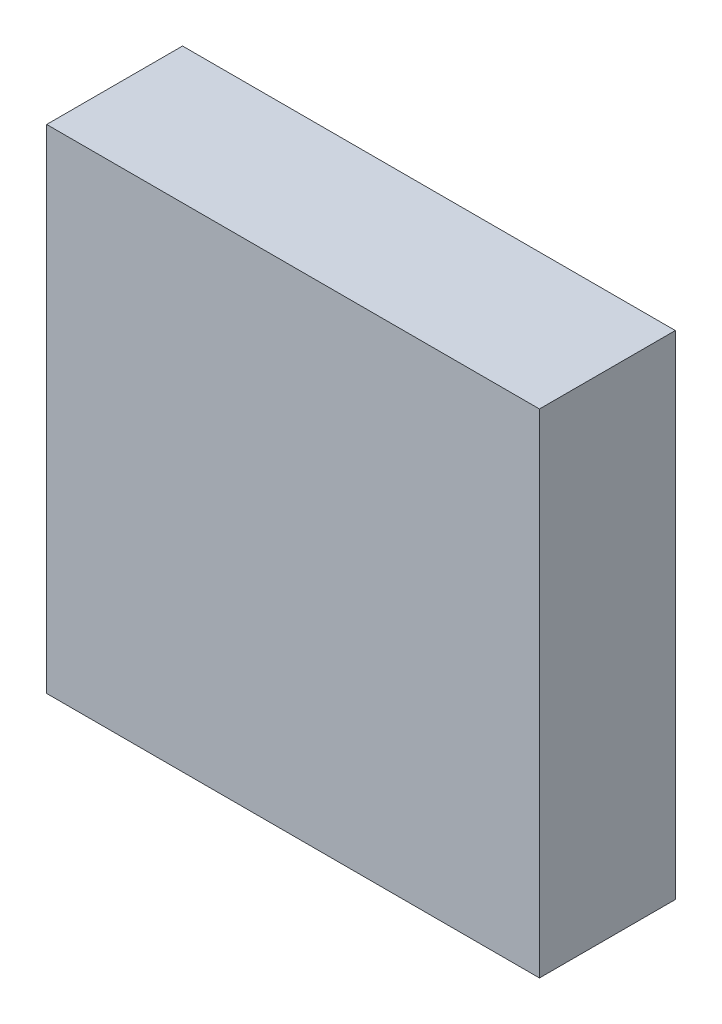
ISO-10303-21;
HEADER;
FILE_DESCRIPTION(('STEP AP214'),'2;1');
FILE_NAME('part.step','',(''),(''),'','','');
FILE_SCHEMA(('AUTOMOTIVE_DESIGN { 1 0 10303 214 1 1 1 1 }'));
ENDSEC;
DATA;
#1=APPLICATION_CONTEXT('core data for automotive mechanical design processes');
#2=APPLICATION_PROTOCOL_DEFINITION('international standard','automotive_design',2000,#1);
#3=PRODUCT_CONTEXT('',#1,'mechanical');
#4=PRODUCT('Part','Part','',(#3));
#5=PRODUCT_RELATED_PRODUCT_CATEGORY('part','',(#4));
#6=PRODUCT_DEFINITION_FORMATION('','',#4);
#7=PRODUCT_DEFINITION_CONTEXT('part definition',#1,'design');
#8=PRODUCT_DEFINITION('design','',#6,#7);
#9=PRODUCT_DEFINITION_SHAPE('','',#8);
#10=(LENGTH_UNIT() NAMED_UNIT(*) SI_UNIT(.MILLI.,.METRE.));
#11=(NAMED_UNIT(*) PLANE_ANGLE_UNIT() SI_UNIT($,.RADIAN.));
#12=(NAMED_UNIT(*) SI_UNIT($,.STERADIAN.) SOLID_ANGLE_UNIT());
#13=UNCERTAINTY_MEASURE_WITH_UNIT(LENGTH_MEASURE(1.E-05),#10,'distance_accuracy_value','');
#14=(GEOMETRIC_REPRESENTATION_CONTEXT(3) GLOBAL_UNCERTAINTY_ASSIGNED_CONTEXT((#13)) GLOBAL_UNIT_ASSIGNED_CONTEXT((#10,
#11,#12)) REPRESENTATION_CONTEXT('',''));
#15=CARTESIAN_POINT('',(0.,0.,0.));
#16=DIRECTION('',(0.,0.,1.));
#17=DIRECTION('',(1.,0.,0.));
#18=AXIS2_PLACEMENT_3D('',#15,#16,#17);
#19=CARTESIAN_POINT('',(-3.62700062,3.62700062,2.00000108));
#20=DIRECTION('',(0.,0.,1.));
#21=DIRECTION('',(1.,0.,0.));
#22=AXIS2_PLACEMENT_3D('',#19,#20,#21);
#23=PLANE('',#22);
#24=DIRECTION('',(0.,1.,0.));
#25=VECTOR('',#24,1.);
#26=CARTESIAN_POINT('',(-3.62700062,-3.62700062,2.00000108));
#27=LINE('',#26,#25);
#28=CARTESIAN_POINT('',(-3.62700062,-3.62700062,2.00000108));
#29=VERTEX_POINT('',#28);
#30=CARTESIAN_POINT('',(-3.62700062,3.62700062,2.00000108));
#31=VERTEX_POINT('',#30);
#32=EDGE_CURVE('E27',#29,#31,#27,.T.);
#33=ORIENTED_EDGE('',*,*,#32,.F.);
#34=DIRECTION('',(-1.,0.,0.));
#35=VECTOR('',#34,1.);
#36=CARTESIAN_POINT('',(3.62700062,-3.62700062,2.00000108));
#37=LINE('',#36,#35);
#38=CARTESIAN_POINT('',(3.62700062,-3.62700062,2.00000108));
#39=VERTEX_POINT('',#38);
#40=EDGE_CURVE('E102',#39,#29,#37,.T.);
#41=ORIENTED_EDGE('',*,*,#40,.F.);
#42=DIRECTION('',(0.,-1.,0.));
#43=VECTOR('',#42,1.);
#44=CARTESIAN_POINT('',(3.62700062,3.62700062,2.00000108));
#45=LINE('',#44,#43);
#46=CARTESIAN_POINT('',(3.62700062,3.62700062,2.00000108));
#47=VERTEX_POINT('',#46);
#48=EDGE_CURVE('E64',#47,#39,#45,.T.);
#49=ORIENTED_EDGE('',*,*,#48,.F.);
#50=DIRECTION('',(1.,0.,0.));
#51=VECTOR('',#50,1.);
#52=CARTESIAN_POINT('',(-3.62700062,3.62700062,2.00000108));
#53=LINE('',#52,#51);
#54=EDGE_CURVE('E79',#31,#47,#53,.T.);
#55=ORIENTED_EDGE('',*,*,#54,.F.);
#56=EDGE_LOOP('',(#33,#41,#49,#55));
#57=FACE_BOUND('',#56,.T.);
#58=ADVANCED_FACE('F16',(#57),#23,.T.);
#59=CARTESIAN_POINT('',(-3.62700062,3.62700062,0.));
#60=DIRECTION('',(0.,0.,1.));
#61=DIRECTION('',(1.,0.,0.));
#62=AXIS2_PLACEMENT_3D('',#59,#60,#61);
#63=PLANE('',#62);
#64=DIRECTION('',(1.,0.,0.));
#65=VECTOR('',#64,1.);
#66=CARTESIAN_POINT('',(-3.62700062,3.62700062,0.));
#67=LINE('',#66,#65);
#68=CARTESIAN_POINT('',(-3.62700062,3.62700062,0.));
#69=VERTEX_POINT('',#68);
#70=CARTESIAN_POINT('',(3.62700062,3.62700062,0.));
#71=VERTEX_POINT('',#70);
#72=EDGE_CURVE('E87',#69,#71,#67,.T.);
#73=ORIENTED_EDGE('',*,*,#72,.T.);
#74=DIRECTION('',(0.,-1.,0.));
#75=VECTOR('',#74,1.);
#76=CARTESIAN_POINT('',(3.62700062,3.62700062,0.));
#77=LINE('',#76,#75);
#78=CARTESIAN_POINT('',(3.62700062,-3.62700062,0.));
#79=VERTEX_POINT('',#78);
#80=EDGE_CURVE('E100',#71,#79,#77,.T.);
#81=ORIENTED_EDGE('',*,*,#80,.T.);
#82=DIRECTION('',(-1.,0.,0.));
#83=VECTOR('',#82,1.);
#84=CARTESIAN_POINT('',(3.62700062,-3.62700062,0.));
#85=LINE('',#84,#83);
#86=CARTESIAN_POINT('',(-3.62700062,-3.62700062,0.));
#87=VERTEX_POINT('',#86);
#88=EDGE_CURVE('E76',#79,#87,#85,.T.);
#89=ORIENTED_EDGE('',*,*,#88,.T.);
#90=DIRECTION('',(0.,1.,0.));
#91=VECTOR('',#90,1.);
#92=CARTESIAN_POINT('',(-3.62700062,-3.62700062,0.));
#93=LINE('',#92,#91);
#94=EDGE_CURVE('E11',#87,#69,#93,.T.);
#95=ORIENTED_EDGE('',*,*,#94,.T.);
#96=EDGE_LOOP('',(#73,#81,#89,#95));
#97=FACE_BOUND('',#96,.T.);
#98=ADVANCED_FACE('F186',(#97),#63,.F.);
#99=CARTESIAN_POINT('',(-3.62700062,-3.62700062,0.));
#100=DIRECTION('',(-1.,0.,0.));
#101=DIRECTION('',(0.,0.,1.));
#102=AXIS2_PLACEMENT_3D('',#99,#100,#101);
#103=PLANE('',#102);
#104=DIRECTION('',(0.,0.,1.));
#105=VECTOR('',#104,1.);
#106=CARTESIAN_POINT('',(-3.62700062,-3.62700062,0.));
#107=LINE('',#106,#105);
#108=EDGE_CURVE('E20',#87,#29,#107,.T.);
#109=ORIENTED_EDGE('',*,*,#108,.T.);
#110=ORIENTED_EDGE('',*,*,#32,.T.);
#111=DIRECTION('',(0.,0.,1.));
#112=VECTOR('',#111,1.);
#113=CARTESIAN_POINT('',(-3.62700062,3.62700062,0.));
#114=LINE('',#113,#112);
#115=EDGE_CURVE('E72',#69,#31,#114,.T.);
#116=ORIENTED_EDGE('',*,*,#115,.F.);
#117=ORIENTED_EDGE('',*,*,#94,.F.);
#118=EDGE_LOOP('',(#109,#110,#116,#117));
#119=FACE_BOUND('',#118,.T.);
#120=ADVANCED_FACE('F70',(#119),#103,.T.);
#121=CARTESIAN_POINT('',(3.62700062,-3.62700062,0.));
#122=DIRECTION('',(0.,-1.,0.));
#123=DIRECTION('',(0.,0.,-1.));
#124=AXIS2_PLACEMENT_3D('',#121,#122,#123);
#125=PLANE('',#124);
#126=DIRECTION('',(0.,0.,1.));
#127=VECTOR('',#126,1.);
#128=CARTESIAN_POINT('',(3.62700062,-3.62700062,0.));
#129=LINE('',#128,#127);
#130=EDGE_CURVE('E97',#79,#39,#129,.T.);
#131=ORIENTED_EDGE('',*,*,#130,.T.);
#132=ORIENTED_EDGE('',*,*,#40,.T.);
#133=ORIENTED_EDGE('',*,*,#108,.F.);
#134=ORIENTED_EDGE('',*,*,#88,.F.);
#135=EDGE_LOOP('',(#131,#132,#133,#134));
#136=FACE_BOUND('',#135,.T.);
#137=ADVANCED_FACE('F167',(#136),#125,.T.);
#138=CARTESIAN_POINT('',(3.62700062,3.62700062,0.));
#139=DIRECTION('',(1.,0.,0.));
#140=DIRECTION('',(0.,1.,0.));
#141=AXIS2_PLACEMENT_3D('',#138,#139,#140);
#142=PLANE('',#141);
#143=DIRECTION('',(0.,0.,1.));
#144=VECTOR('',#143,1.);
#145=CARTESIAN_POINT('',(3.62700062,3.62700062,0.));
#146=LINE('',#145,#144);
#147=EDGE_CURVE('E83',#71,#47,#146,.T.);
#148=ORIENTED_EDGE('',*,*,#147,.T.);
#149=ORIENTED_EDGE('',*,*,#48,.T.);
#150=ORIENTED_EDGE('',*,*,#130,.F.);
#151=ORIENTED_EDGE('',*,*,#80,.F.);
#152=EDGE_LOOP('',(#148,#149,#150,#151));
#153=FACE_BOUND('',#152,.T.);
#154=ADVANCED_FACE('F157',(#153),#142,.T.);
#155=CARTESIAN_POINT('',(-3.62700062,3.62700062,0.));
#156=DIRECTION('',(0.,1.,0.));
#157=DIRECTION('',(1.,0.,0.));
#158=AXIS2_PLACEMENT_3D('',#155,#156,#157);
#159=PLANE('',#158);
#160=ORIENTED_EDGE('',*,*,#115,.T.);
#161=ORIENTED_EDGE('',*,*,#54,.T.);
#162=ORIENTED_EDGE('',*,*,#147,.F.);
#163=ORIENTED_EDGE('',*,*,#72,.F.);
#164=EDGE_LOOP('',(#160,#161,#162,#163));
#165=FACE_BOUND('',#164,.T.);
#166=ADVANCED_FACE('F18',(#165),#159,.T.);
#167=CLOSED_SHELL('',(#58,#98,#120,#137,#154,#166));
#168=MANIFOLD_SOLID_BREP('B1',#167);
#169=ADVANCED_BREP_SHAPE_REPRESENTATION('',(#18,#168),#14);
#170=SHAPE_DEFINITION_REPRESENTATION(#9,#169);
ENDSEC;
END-ISO-10303-21;
